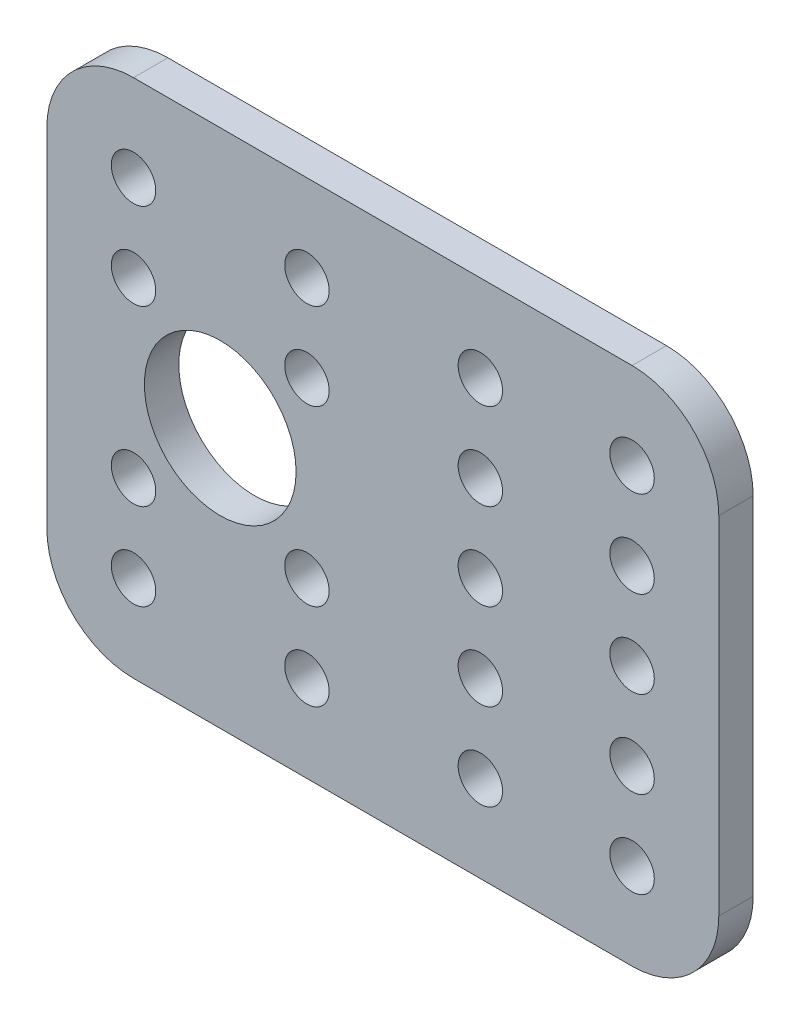
ISO-10303-21;
HEADER;
FILE_DESCRIPTION(('STEP AP214'),'2;1');
FILE_NAME('part.step','',(''),(''),'','','');
FILE_SCHEMA(('AUTOMOTIVE_DESIGN { 1 0 10303 214 1 1 1 1 }'));
ENDSEC;
DATA;
#1=APPLICATION_CONTEXT('core data for automotive mechanical design processes');
#2=APPLICATION_PROTOCOL_DEFINITION('international standard','automotive_design',2000,#1);
#3=PRODUCT_CONTEXT('',#1,'mechanical');
#4=PRODUCT('Part','Part','',(#3));
#5=PRODUCT_RELATED_PRODUCT_CATEGORY('part','',(#4));
#6=PRODUCT_DEFINITION_FORMATION('','',#4);
#7=PRODUCT_DEFINITION_CONTEXT('part definition',#1,'design');
#8=PRODUCT_DEFINITION('design','',#6,#7);
#9=PRODUCT_DEFINITION_SHAPE('','',#8);
#10=(LENGTH_UNIT() NAMED_UNIT(*) SI_UNIT(.MILLI.,.METRE.));
#11=(NAMED_UNIT(*) PLANE_ANGLE_UNIT() SI_UNIT($,.RADIAN.));
#12=(NAMED_UNIT(*) SI_UNIT($,.STERADIAN.) SOLID_ANGLE_UNIT());
#13=UNCERTAINTY_MEASURE_WITH_UNIT(LENGTH_MEASURE(1.E-05),#10,'distance_accuracy_value','');
#14=(GEOMETRIC_REPRESENTATION_CONTEXT(3) GLOBAL_UNCERTAINTY_ASSIGNED_CONTEXT((#13)) GLOBAL_UNIT_ASSIGNED_CONTEXT((#10,
#11,#12)) REPRESENTATION_CONTEXT('',''));
#15=CARTESIAN_POINT('',(0.,0.,0.));
#16=DIRECTION('',(0.,0.,1.));
#17=DIRECTION('',(1.,0.,0.));
#18=AXIS2_PLACEMENT_3D('',#15,#16,#17);
#19=CARTESIAN_POINT('',(0.,0.,-3.175));
#20=DIRECTION('',(0.,0.,-1.));
#21=DIRECTION('',(1.,0.,0.));
#22=AXIS2_PLACEMENT_3D('',#19,#20,#21);
#23=PLANE('',#22);
#24=CARTESIAN_POINT('',(23.0000000000002,-8.00000000000001,-3.175));
#25=DIRECTION('',(0.,0.,1.));
#26=DIRECTION('',(1.,0.,0.));
#27=AXIS2_PLACEMENT_3D('',#24,#25,#26);
#28=CIRCLE('',#27,2.05);
#29=CARTESIAN_POINT('',(25.0500000000002,-8.00000000000001,-3.175));
#30=VERTEX_POINT('',#29);
#31=EDGE_CURVE('E273',#30,#30,#28,.T.);
#32=ORIENTED_EDGE('',*,*,#31,.T.);
#33=EDGE_LOOP('',(#32));
#34=FACE_BOUND('',#33,.T.);
#35=CARTESIAN_POINT('',(23.0000000000001,7.99999999999999,-3.175));
#36=DIRECTION('',(0.,0.,1.));
#37=DIRECTION('',(1.,0.,0.));
#38=AXIS2_PLACEMENT_3D('',#35,#36,#37);
#39=CIRCLE('',#38,2.05);
#40=CARTESIAN_POINT('',(25.0500000000001,7.99999999999999,-3.175));
#41=VERTEX_POINT('',#40);
#42=EDGE_CURVE('E261',#41,#41,#39,.T.);
#43=ORIENTED_EDGE('',*,*,#42,.T.);
#44=EDGE_LOOP('',(#43));
#45=FACE_BOUND('',#44,.T.);
#46=CARTESIAN_POINT('',(-22.9999999999997,-8.00000000000001,-3.175));
#47=DIRECTION('',(0.,0.,1.));
#48=DIRECTION('',(1.,0.,0.));
#49=AXIS2_PLACEMENT_3D('',#46,#47,#48);
#50=CIRCLE('',#49,2.05);
#51=CARTESIAN_POINT('',(-20.9499999999997,-8.00000000000001,-3.175));
#52=VERTEX_POINT('',#51);
#53=EDGE_CURVE('E249',#52,#52,#50,.T.);
#54=ORIENTED_EDGE('',*,*,#53,.T.);
#55=EDGE_LOOP('',(#54));
#56=FACE_BOUND('',#55,.T.);
#57=CARTESIAN_POINT('',(9.00000000000034,-16.,-3.175));
#58=DIRECTION('',(0.,0.,1.));
#59=DIRECTION('',(1.,0.,0.));
#60=AXIS2_PLACEMENT_3D('',#57,#58,#59);
#61=CIRCLE('',#60,2.04999999999999);
#62=CARTESIAN_POINT('',(11.0500000000003,-16.,-3.175));
#63=VERTEX_POINT('',#62);
#64=EDGE_CURVE('E237',#63,#63,#61,.T.);
#65=ORIENTED_EDGE('',*,*,#64,.T.);
#66=EDGE_LOOP('',(#65));
#67=FACE_BOUND('',#66,.T.);
#68=CARTESIAN_POINT('',(9.00000000000026,-8.00000000000001,-3.175));
#69=DIRECTION('',(0.,0.,1.));
#70=DIRECTION('',(1.,0.,0.));
#71=AXIS2_PLACEMENT_3D('',#68,#69,#70);
#72=CIRCLE('',#71,2.04999999999999);
#73=CARTESIAN_POINT('',(11.0500000000003,-8.00000000000001,-3.175));
#74=VERTEX_POINT('',#73);
#75=EDGE_CURVE('E225',#74,#74,#72,.T.);
#76=ORIENTED_EDGE('',*,*,#75,.T.);
#77=EDGE_LOOP('',(#76));
#78=FACE_BOUND('',#77,.T.);
#79=CARTESIAN_POINT('',(9.00000000000017,0.,-3.175));
#80=DIRECTION('',(0.,0.,1.));
#81=DIRECTION('',(1.,0.,0.));
#82=AXIS2_PLACEMENT_3D('',#79,#80,#81);
#83=CIRCLE('',#82,2.04999999999999);
#84=CARTESIAN_POINT('',(11.0500000000002,0.,-3.175));
#85=VERTEX_POINT('',#84);
#86=EDGE_CURVE('E213',#85,#85,#83,.T.);
#87=ORIENTED_EDGE('',*,*,#86,.T.);
#88=EDGE_LOOP('',(#87));
#89=FACE_BOUND('',#88,.T.);
#90=CARTESIAN_POINT('',(-6.99999999999991,7.99999999999999,-3.175));
#91=DIRECTION('',(0.,0.,1.));
#92=DIRECTION('',(1.,0.,0.));
#93=AXIS2_PLACEMENT_3D('',#90,#91,#92);
#94=CIRCLE('',#93,2.05);
#95=CARTESIAN_POINT('',(-4.94999999999991,7.99999999999999,-3.175));
#96=VERTEX_POINT('',#95);
#97=EDGE_CURVE('E201',#96,#96,#94,.T.);
#98=ORIENTED_EDGE('',*,*,#97,.T.);
#99=EDGE_LOOP('',(#98));
#100=FACE_BOUND('',#99,.T.);
#101=CARTESIAN_POINT('',(-6.99999999999999,16.,-3.175));
#102=DIRECTION('',(0.,0.,1.));
#103=DIRECTION('',(1.,0.,0.));
#104=AXIS2_PLACEMENT_3D('',#101,#102,#103);
#105=CIRCLE('',#104,2.05);
#106=CARTESIAN_POINT('',(-4.94999999999999,16.,-3.175));
#107=VERTEX_POINT('',#106);
#108=EDGE_CURVE('E189',#107,#107,#105,.T.);
#109=ORIENTED_EDGE('',*,*,#108,.T.);
#110=EDGE_LOOP('',(#109));
#111=FACE_BOUND('',#110,.T.);
#112=CARTESIAN_POINT('',(-23.,16.,-3.175));
#113=DIRECTION('',(0.,0.,1.));
#114=DIRECTION('',(1.,0.,0.));
#115=AXIS2_PLACEMENT_3D('',#112,#113,#114);
#116=CIRCLE('',#115,2.05);
#117=CARTESIAN_POINT('',(-20.95,16.,-3.175));
#118=VERTEX_POINT('',#117);
#119=EDGE_CURVE('E178',#118,#118,#116,.T.);
#120=ORIENTED_EDGE('',*,*,#119,.T.);
#121=EDGE_LOOP('',(#120));
#122=FACE_BOUND('',#121,.T.);
#123=DIRECTION('',(0.,1.,0.));
#124=VECTOR('',#123,1.);
#125=CARTESIAN_POINT('',(31.,-24.,-3.175));
#126=LINE('',#125,#124);
#127=CARTESIAN_POINT('',(31.,-16.,-3.175));
#128=VERTEX_POINT('',#127);
#129=CARTESIAN_POINT('',(31.,16.,-3.175));
#130=VERTEX_POINT('',#129);
#131=EDGE_CURVE('E173',#128,#130,#126,.T.);
#132=ORIENTED_EDGE('',*,*,#131,.F.);
#133=CARTESIAN_POINT('',(23.,-16.,-3.175));
#134=DIRECTION('',(0.,0.,1.));
#135=DIRECTION('',(1.,0.,0.));
#136=AXIS2_PLACEMENT_3D('',#133,#134,#135);
#137=CIRCLE('',#136,8.);
#138=CARTESIAN_POINT('',(23.,-24.,-3.175));
#139=VERTEX_POINT('',#138);
#140=EDGE_CURVE('E152',#139,#128,#137,.T.);
#141=ORIENTED_EDGE('',*,*,#140,.F.);
#142=DIRECTION('',(1.,0.,0.));
#143=VECTOR('',#142,1.);
#144=CARTESIAN_POINT('',(31.,-24.,-3.175));
#145=LINE('',#144,#143);
#146=CARTESIAN_POINT('',(-23.,-24.,-3.175));
#147=VERTEX_POINT('',#146);
#148=EDGE_CURVE('E131',#147,#139,#145,.T.);
#149=ORIENTED_EDGE('',*,*,#148,.F.);
#150=CARTESIAN_POINT('',(-23.,-16.,-3.175));
#151=DIRECTION('',(0.,0.,1.));
#152=DIRECTION('',(1.,0.,0.));
#153=AXIS2_PLACEMENT_3D('',#150,#151,#152);
#154=CIRCLE('',#153,8.);
#155=CARTESIAN_POINT('',(-31.,-16.,-3.175));
#156=VERTEX_POINT('',#155);
#157=EDGE_CURVE('E150',#156,#147,#154,.T.);
#158=ORIENTED_EDGE('',*,*,#157,.F.);
#159=DIRECTION('',(0.,-1.,0.));
#160=VECTOR('',#159,1.);
#161=CARTESIAN_POINT('',(-31.,-24.,-3.175));
#162=LINE('',#161,#160);
#163=CARTESIAN_POINT('',(-31.,16.,-3.175));
#164=VERTEX_POINT('',#163);
#165=EDGE_CURVE('E128',#164,#156,#162,.T.);
#166=ORIENTED_EDGE('',*,*,#165,.F.);
#167=CARTESIAN_POINT('',(-23.,16.,-3.175));
#168=DIRECTION('',(0.,0.,1.));
#169=DIRECTION('',(1.,0.,0.));
#170=AXIS2_PLACEMENT_3D('',#167,#168,#169);
#171=CIRCLE('',#170,8.);
#172=CARTESIAN_POINT('',(-23.,24.,-3.175));
#173=VERTEX_POINT('',#172);
#174=EDGE_CURVE('E147',#173,#164,#171,.T.);
#175=ORIENTED_EDGE('',*,*,#174,.F.);
#176=DIRECTION('',(-1.,0.,0.));
#177=VECTOR('',#176,1.);
#178=CARTESIAN_POINT('',(31.,24.,-3.175));
#179=LINE('',#178,#177);
#180=CARTESIAN_POINT('',(23.,24.,-3.175));
#181=VERTEX_POINT('',#180);
#182=EDGE_CURVE('E137',#181,#173,#179,.T.);
#183=ORIENTED_EDGE('',*,*,#182,.F.);
#184=CARTESIAN_POINT('',(23.,16.,-3.175));
#185=DIRECTION('',(0.,0.,1.));
#186=DIRECTION('',(1.,0.,0.));
#187=AXIS2_PLACEMENT_3D('',#184,#185,#186);
#188=CIRCLE('',#187,8.);
#189=EDGE_CURVE('E106',#130,#181,#188,.T.);
#190=ORIENTED_EDGE('',*,*,#189,.F.);
#191=EDGE_LOOP('',(#132,#141,#149,#158,#166,#175,#183,#190));
#192=FACE_BOUND('',#191,.T.);
#193=CARTESIAN_POINT('',(-15.,0.,-3.175));
#194=DIRECTION('',(0.,0.,1.));
#195=DIRECTION('',(1.,0.,0.));
#196=AXIS2_PLACEMENT_3D('',#193,#194,#195);
#197=CIRCLE('',#196,7.);
#198=CARTESIAN_POINT('',(-7.99999999999999,0.,-3.175));
#199=VERTEX_POINT('',#198);
#200=EDGE_CURVE('E165',#199,#199,#197,.T.);
#201=ORIENTED_EDGE('',*,*,#200,.T.);
#202=EDGE_LOOP('',(#201));
#203=FACE_BOUND('',#202,.T.);
#204=CARTESIAN_POINT('',(23.,16.,-3.175));
#205=DIRECTION('',(0.,0.,1.));
#206=DIRECTION('',(1.,0.,0.));
#207=AXIS2_PLACEMENT_3D('',#204,#205,#206);
#208=CIRCLE('',#207,2.05);
#209=CARTESIAN_POINT('',(25.05,16.,-3.175));
#210=VERTEX_POINT('',#209);
#211=EDGE_CURVE('E183',#210,#210,#208,.T.);
#212=ORIENTED_EDGE('',*,*,#211,.T.);
#213=EDGE_LOOP('',(#212));
#214=FACE_BOUND('',#213,.T.);
#215=CARTESIAN_POINT('',(9.00000000000001,16.,-3.175));
#216=DIRECTION('',(0.,0.,1.));
#217=DIRECTION('',(1.,0.,0.));
#218=AXIS2_PLACEMENT_3D('',#215,#216,#217);
#219=CIRCLE('',#218,2.04999999999999);
#220=CARTESIAN_POINT('',(11.05,16.,-3.175));
#221=VERTEX_POINT('',#220);
#222=EDGE_CURVE('E195',#221,#221,#219,.T.);
#223=ORIENTED_EDGE('',*,*,#222,.T.);
#224=EDGE_LOOP('',(#223));
#225=FACE_BOUND('',#224,.T.);
#226=CARTESIAN_POINT('',(9.00000000000009,7.99999999999999,-3.175));
#227=DIRECTION('',(0.,0.,1.));
#228=DIRECTION('',(1.,0.,0.));
#229=AXIS2_PLACEMENT_3D('',#226,#227,#228);
#230=CIRCLE('',#229,2.04999999999999);
#231=CARTESIAN_POINT('',(11.0500000000001,7.99999999999999,-3.175));
#232=VERTEX_POINT('',#231);
#233=EDGE_CURVE('E207',#232,#232,#230,.T.);
#234=ORIENTED_EDGE('',*,*,#233,.T.);
#235=EDGE_LOOP('',(#234));
#236=FACE_BOUND('',#235,.T.);
#237=CARTESIAN_POINT('',(-6.99999999999974,-8.00000000000001,-3.175));
#238=DIRECTION('',(0.,0.,1.));
#239=DIRECTION('',(1.,0.,0.));
#240=AXIS2_PLACEMENT_3D('',#237,#238,#239);
#241=CIRCLE('',#240,2.04999999999999);
#242=CARTESIAN_POINT('',(-4.94999999999975,-8.00000000000001,-3.175));
#243=VERTEX_POINT('',#242);
#244=EDGE_CURVE('E219',#243,#243,#241,.T.);
#245=ORIENTED_EDGE('',*,*,#244,.T.);
#246=EDGE_LOOP('',(#245));
#247=FACE_BOUND('',#246,.T.);
#248=CARTESIAN_POINT('',(-6.99999999999966,-16.,-3.175));
#249=DIRECTION('',(0.,0.,1.));
#250=DIRECTION('',(1.,0.,0.));
#251=AXIS2_PLACEMENT_3D('',#248,#249,#250);
#252=CIRCLE('',#251,2.05);
#253=CARTESIAN_POINT('',(-4.94999999999966,-16.,-3.175));
#254=VERTEX_POINT('',#253);
#255=EDGE_CURVE('E231',#254,#254,#252,.T.);
#256=ORIENTED_EDGE('',*,*,#255,.T.);
#257=EDGE_LOOP('',(#256));
#258=FACE_BOUND('',#257,.T.);
#259=CARTESIAN_POINT('',(-22.9999999999999,7.99999999999999,-3.175));
#260=DIRECTION('',(0.,0.,1.));
#261=DIRECTION('',(1.,0.,0.));
#262=AXIS2_PLACEMENT_3D('',#259,#260,#261);
#263=CIRCLE('',#262,2.05);
#264=CARTESIAN_POINT('',(-20.9499999999999,7.99999999999999,-3.175));
#265=VERTEX_POINT('',#264);
#266=EDGE_CURVE('E243',#265,#265,#263,.T.);
#267=ORIENTED_EDGE('',*,*,#266,.T.);
#268=EDGE_LOOP('',(#267));
#269=FACE_BOUND('',#268,.T.);
#270=CARTESIAN_POINT('',(-22.9999999999997,-16.,-3.175));
#271=DIRECTION('',(0.,0.,1.));
#272=DIRECTION('',(1.,0.,0.));
#273=AXIS2_PLACEMENT_3D('',#270,#271,#272);
#274=CIRCLE('',#273,2.05);
#275=CARTESIAN_POINT('',(-20.9499999999997,-16.,-3.175));
#276=VERTEX_POINT('',#275);
#277=EDGE_CURVE('E255',#276,#276,#274,.T.);
#278=ORIENTED_EDGE('',*,*,#277,.T.);
#279=EDGE_LOOP('',(#278));
#280=FACE_BOUND('',#279,.T.);
#281=CARTESIAN_POINT('',(23.0000000000002,0.,-3.175));
#282=DIRECTION('',(0.,0.,1.));
#283=DIRECTION('',(1.,0.,0.));
#284=AXIS2_PLACEMENT_3D('',#281,#282,#283);
#285=CIRCLE('',#284,2.05);
#286=CARTESIAN_POINT('',(25.0500000000002,0.,-3.175));
#287=VERTEX_POINT('',#286);
#288=EDGE_CURVE('E267',#287,#287,#285,.T.);
#289=ORIENTED_EDGE('',*,*,#288,.T.);
#290=EDGE_LOOP('',(#289));
#291=FACE_BOUND('',#290,.T.);
#292=CARTESIAN_POINT('',(23.0000000000003,-16.,-3.175));
#293=DIRECTION('',(0.,0.,1.));
#294=DIRECTION('',(1.,0.,0.));
#295=AXIS2_PLACEMENT_3D('',#292,#293,#294);
#296=CIRCLE('',#295,2.05);
#297=CARTESIAN_POINT('',(25.0500000000003,-16.,-3.175));
#298=VERTEX_POINT('',#297);
#299=EDGE_CURVE('E279',#298,#298,#296,.T.);
#300=ORIENTED_EDGE('',*,*,#299,.T.);
#301=EDGE_LOOP('',(#300));
#302=FACE_BOUND('',#301,.T.);
#303=ADVANCED_FACE('F35',(#34,#45,#56,#67,#78,#89,#100,#111,#122,#192,#203,#214,#225,#236,#247,
#258,#269,#280,#291,#302),#23,.T.);
#304=CARTESIAN_POINT('',(0.,0.,0.));
#305=DIRECTION('',(0.,0.,-1.));
#306=DIRECTION('',(1.,0.,0.));
#307=AXIS2_PLACEMENT_3D('',#304,#305,#306);
#308=PLANE('',#307);
#309=DIRECTION('',(-1.,0.,0.));
#310=VECTOR('',#309,1.);
#311=CARTESIAN_POINT('',(31.,24.,0.));
#312=LINE('',#311,#310);
#313=CARTESIAN_POINT('',(23.,24.,0.));
#314=VERTEX_POINT('',#313);
#315=CARTESIAN_POINT('',(-23.,24.,0.));
#316=VERTEX_POINT('',#315);
#317=EDGE_CURVE('E119',#314,#316,#312,.T.);
#318=ORIENTED_EDGE('',*,*,#317,.T.);
#319=CARTESIAN_POINT('',(-23.,16.,0.));
#320=DIRECTION('',(0.,0.,1.));
#321=DIRECTION('',(1.,0.,0.));
#322=AXIS2_PLACEMENT_3D('',#319,#320,#321);
#323=CIRCLE('',#322,8.);
#324=CARTESIAN_POINT('',(-31.,16.,0.));
#325=VERTEX_POINT('',#324);
#326=EDGE_CURVE('E111',#325,#316,#323,.F.);
#327=ORIENTED_EDGE('',*,*,#326,.F.);
#328=DIRECTION('',(0.,-1.,0.));
#329=VECTOR('',#328,1.);
#330=CARTESIAN_POINT('',(-31.,-24.,0.));
#331=LINE('',#330,#329);
#332=CARTESIAN_POINT('',(-31.,-16.,0.));
#333=VERTEX_POINT('',#332);
#334=EDGE_CURVE('E162',#325,#333,#331,.T.);
#335=ORIENTED_EDGE('',*,*,#334,.T.);
#336=CARTESIAN_POINT('',(-23.,-16.,0.));
#337=DIRECTION('',(0.,0.,1.));
#338=DIRECTION('',(1.,0.,0.));
#339=AXIS2_PLACEMENT_3D('',#336,#337,#338);
#340=CIRCLE('',#339,8.);
#341=CARTESIAN_POINT('',(-23.,-24.,0.));
#342=VERTEX_POINT('',#341);
#343=EDGE_CURVE('E140',#342,#333,#340,.F.);
#344=ORIENTED_EDGE('',*,*,#343,.F.);
#345=DIRECTION('',(1.,0.,0.));
#346=VECTOR('',#345,1.);
#347=CARTESIAN_POINT('',(31.,-24.,0.));
#348=LINE('',#347,#346);
#349=CARTESIAN_POINT('',(23.,-24.,0.));
#350=VERTEX_POINT('',#349);
#351=EDGE_CURVE('E133',#342,#350,#348,.T.);
#352=ORIENTED_EDGE('',*,*,#351,.T.);
#353=CARTESIAN_POINT('',(23.,-16.,0.));
#354=DIRECTION('',(0.,0.,1.));
#355=DIRECTION('',(1.,0.,0.));
#356=AXIS2_PLACEMENT_3D('',#353,#354,#355);
#357=CIRCLE('',#356,8.);
#358=CARTESIAN_POINT('',(31.,-16.,0.));
#359=VERTEX_POINT('',#358);
#360=EDGE_CURVE('E124',#359,#350,#357,.F.);
#361=ORIENTED_EDGE('',*,*,#360,.F.);
#362=DIRECTION('',(0.,1.,0.));
#363=VECTOR('',#362,1.);
#364=CARTESIAN_POINT('',(31.,-24.,0.));
#365=LINE('',#364,#363);
#366=CARTESIAN_POINT('',(31.,16.,0.));
#367=VERTEX_POINT('',#366);
#368=EDGE_CURVE('E122',#359,#367,#365,.T.);
#369=ORIENTED_EDGE('',*,*,#368,.T.);
#370=CARTESIAN_POINT('',(23.,16.,0.));
#371=DIRECTION('',(0.,0.,1.));
#372=DIRECTION('',(1.,0.,0.));
#373=AXIS2_PLACEMENT_3D('',#370,#371,#372);
#374=CIRCLE('',#373,8.);
#375=EDGE_CURVE('E103',#314,#367,#374,.F.);
#376=ORIENTED_EDGE('',*,*,#375,.F.);
#377=EDGE_LOOP('',(#318,#327,#335,#344,#352,#361,#369,#376));
#378=FACE_BOUND('',#377,.T.);
#379=CARTESIAN_POINT('',(-15.,0.,0.));
#380=DIRECTION('',(0.,0.,1.));
#381=DIRECTION('',(1.,0.,0.));
#382=AXIS2_PLACEMENT_3D('',#379,#380,#381);
#383=CIRCLE('',#382,7.);
#384=CARTESIAN_POINT('',(-7.99999999999999,0.,0.));
#385=VERTEX_POINT('',#384);
#386=EDGE_CURVE('E169',#385,#385,#383,.T.);
#387=ORIENTED_EDGE('',*,*,#386,.F.);
#388=EDGE_LOOP('',(#387));
#389=FACE_BOUND('',#388,.T.);
#390=CARTESIAN_POINT('',(-23.,16.,0.));
#391=DIRECTION('',(0.,0.,1.));
#392=DIRECTION('',(1.,0.,0.));
#393=AXIS2_PLACEMENT_3D('',#390,#391,#392);
#394=CIRCLE('',#393,2.05);
#395=CARTESIAN_POINT('',(-20.95,16.,0.));
#396=VERTEX_POINT('',#395);
#397=EDGE_CURVE('E180',#396,#396,#394,.T.);
#398=ORIENTED_EDGE('',*,*,#397,.F.);
#399=EDGE_LOOP('',(#398));
#400=FACE_BOUND('',#399,.T.);
#401=CARTESIAN_POINT('',(23.,16.,0.));
#402=DIRECTION('',(0.,0.,1.));
#403=DIRECTION('',(1.,0.,0.));
#404=AXIS2_PLACEMENT_3D('',#401,#402,#403);
#405=CIRCLE('',#404,2.05);
#406=CARTESIAN_POINT('',(25.05,16.,0.));
#407=VERTEX_POINT('',#406);
#408=EDGE_CURVE('E186',#407,#407,#405,.T.);
#409=ORIENTED_EDGE('',*,*,#408,.F.);
#410=EDGE_LOOP('',(#409));
#411=FACE_BOUND('',#410,.T.);
#412=CARTESIAN_POINT('',(-6.99999999999999,16.,0.));
#413=DIRECTION('',(0.,0.,1.));
#414=DIRECTION('',(1.,0.,0.));
#415=AXIS2_PLACEMENT_3D('',#412,#413,#414);
#416=CIRCLE('',#415,2.05);
#417=CARTESIAN_POINT('',(-4.94999999999999,16.,0.));
#418=VERTEX_POINT('',#417);
#419=EDGE_CURVE('E192',#418,#418,#416,.T.);
#420=ORIENTED_EDGE('',*,*,#419,.F.);
#421=EDGE_LOOP('',(#420));
#422=FACE_BOUND('',#421,.T.);
#423=CARTESIAN_POINT('',(9.00000000000001,16.,0.));
#424=DIRECTION('',(0.,0.,1.));
#425=DIRECTION('',(1.,0.,0.));
#426=AXIS2_PLACEMENT_3D('',#423,#424,#425);
#427=CIRCLE('',#426,2.04999999999999);
#428=CARTESIAN_POINT('',(11.05,16.,0.));
#429=VERTEX_POINT('',#428);
#430=EDGE_CURVE('E198',#429,#429,#427,.T.);
#431=ORIENTED_EDGE('',*,*,#430,.F.);
#432=EDGE_LOOP('',(#431));
#433=FACE_BOUND('',#432,.T.);
#434=CARTESIAN_POINT('',(-6.99999999999991,7.99999999999999,0.));
#435=DIRECTION('',(0.,0.,1.));
#436=DIRECTION('',(1.,0.,0.));
#437=AXIS2_PLACEMENT_3D('',#434,#435,#436);
#438=CIRCLE('',#437,2.05);
#439=CARTESIAN_POINT('',(-4.94999999999991,7.99999999999999,0.));
#440=VERTEX_POINT('',#439);
#441=EDGE_CURVE('E204',#440,#440,#438,.T.);
#442=ORIENTED_EDGE('',*,*,#441,.F.);
#443=EDGE_LOOP('',(#442));
#444=FACE_BOUND('',#443,.T.);
#445=CARTESIAN_POINT('',(9.00000000000009,7.99999999999999,0.));
#446=DIRECTION('',(0.,0.,1.));
#447=DIRECTION('',(1.,0.,0.));
#448=AXIS2_PLACEMENT_3D('',#445,#446,#447);
#449=CIRCLE('',#448,2.04999999999999);
#450=CARTESIAN_POINT('',(11.0500000000001,7.99999999999999,0.));
#451=VERTEX_POINT('',#450);
#452=EDGE_CURVE('E210',#451,#451,#449,.T.);
#453=ORIENTED_EDGE('',*,*,#452,.F.);
#454=EDGE_LOOP('',(#453));
#455=FACE_BOUND('',#454,.T.);
#456=CARTESIAN_POINT('',(9.00000000000017,0.,0.));
#457=DIRECTION('',(0.,0.,1.));
#458=DIRECTION('',(1.,0.,0.));
#459=AXIS2_PLACEMENT_3D('',#456,#457,#458);
#460=CIRCLE('',#459,2.04999999999999);
#461=CARTESIAN_POINT('',(11.0500000000002,0.,0.));
#462=VERTEX_POINT('',#461);
#463=EDGE_CURVE('E216',#462,#462,#460,.T.);
#464=ORIENTED_EDGE('',*,*,#463,.F.);
#465=EDGE_LOOP('',(#464));
#466=FACE_BOUND('',#465,.T.);
#467=CARTESIAN_POINT('',(-6.99999999999974,-8.00000000000001,0.));
#468=DIRECTION('',(0.,0.,1.));
#469=DIRECTION('',(1.,0.,0.));
#470=AXIS2_PLACEMENT_3D('',#467,#468,#469);
#471=CIRCLE('',#470,2.04999999999999);
#472=CARTESIAN_POINT('',(-4.94999999999975,-8.00000000000001,0.));
#473=VERTEX_POINT('',#472);
#474=EDGE_CURVE('E222',#473,#473,#471,.T.);
#475=ORIENTED_EDGE('',*,*,#474,.F.);
#476=EDGE_LOOP('',(#475));
#477=FACE_BOUND('',#476,.T.);
#478=CARTESIAN_POINT('',(9.00000000000026,-8.00000000000001,0.));
#479=DIRECTION('',(0.,0.,1.));
#480=DIRECTION('',(1.,0.,0.));
#481=AXIS2_PLACEMENT_3D('',#478,#479,#480);
#482=CIRCLE('',#481,2.04999999999999);
#483=CARTESIAN_POINT('',(11.0500000000003,-8.00000000000001,0.));
#484=VERTEX_POINT('',#483);
#485=EDGE_CURVE('E228',#484,#484,#482,.T.);
#486=ORIENTED_EDGE('',*,*,#485,.F.);
#487=EDGE_LOOP('',(#486));
#488=FACE_BOUND('',#487,.T.);
#489=CARTESIAN_POINT('',(-6.99999999999966,-16.,0.));
#490=DIRECTION('',(0.,0.,1.));
#491=DIRECTION('',(1.,0.,0.));
#492=AXIS2_PLACEMENT_3D('',#489,#490,#491);
#493=CIRCLE('',#492,2.05);
#494=CARTESIAN_POINT('',(-4.94999999999966,-16.,0.));
#495=VERTEX_POINT('',#494);
#496=EDGE_CURVE('E234',#495,#495,#493,.T.);
#497=ORIENTED_EDGE('',*,*,#496,.F.);
#498=EDGE_LOOP('',(#497));
#499=FACE_BOUND('',#498,.T.);
#500=CARTESIAN_POINT('',(9.00000000000034,-16.,0.));
#501=DIRECTION('',(0.,0.,1.));
#502=DIRECTION('',(1.,0.,0.));
#503=AXIS2_PLACEMENT_3D('',#500,#501,#502);
#504=CIRCLE('',#503,2.04999999999999);
#505=CARTESIAN_POINT('',(11.0500000000003,-16.,0.));
#506=VERTEX_POINT('',#505);
#507=EDGE_CURVE('E240',#506,#506,#504,.T.);
#508=ORIENTED_EDGE('',*,*,#507,.F.);
#509=EDGE_LOOP('',(#508));
#510=FACE_BOUND('',#509,.T.);
#511=CARTESIAN_POINT('',(-22.9999999999999,7.99999999999999,0.));
#512=DIRECTION('',(0.,0.,1.));
#513=DIRECTION('',(1.,0.,0.));
#514=AXIS2_PLACEMENT_3D('',#511,#512,#513);
#515=CIRCLE('',#514,2.05);
#516=CARTESIAN_POINT('',(-20.9499999999999,7.99999999999999,0.));
#517=VERTEX_POINT('',#516);
#518=EDGE_CURVE('E246',#517,#517,#515,.T.);
#519=ORIENTED_EDGE('',*,*,#518,.F.);
#520=EDGE_LOOP('',(#519));
#521=FACE_BOUND('',#520,.T.);
#522=CARTESIAN_POINT('',(-22.9999999999997,-8.00000000000001,0.));
#523=DIRECTION('',(0.,0.,1.));
#524=DIRECTION('',(1.,0.,0.));
#525=AXIS2_PLACEMENT_3D('',#522,#523,#524);
#526=CIRCLE('',#525,2.05);
#527=CARTESIAN_POINT('',(-20.9499999999997,-8.00000000000001,0.));
#528=VERTEX_POINT('',#527);
#529=EDGE_CURVE('E252',#528,#528,#526,.T.);
#530=ORIENTED_EDGE('',*,*,#529,.F.);
#531=EDGE_LOOP('',(#530));
#532=FACE_BOUND('',#531,.T.);
#533=CARTESIAN_POINT('',(-22.9999999999997,-16.,0.));
#534=DIRECTION('',(0.,0.,1.));
#535=DIRECTION('',(1.,0.,0.));
#536=AXIS2_PLACEMENT_3D('',#533,#534,#535);
#537=CIRCLE('',#536,2.05);
#538=CARTESIAN_POINT('',(-20.9499999999997,-16.,0.));
#539=VERTEX_POINT('',#538);
#540=EDGE_CURVE('E258',#539,#539,#537,.T.);
#541=ORIENTED_EDGE('',*,*,#540,.F.);
#542=EDGE_LOOP('',(#541));
#543=FACE_BOUND('',#542,.T.);
#544=CARTESIAN_POINT('',(23.0000000000001,7.99999999999999,0.));
#545=DIRECTION('',(0.,0.,1.));
#546=DIRECTION('',(1.,0.,0.));
#547=AXIS2_PLACEMENT_3D('',#544,#545,#546);
#548=CIRCLE('',#547,2.05);
#549=CARTESIAN_POINT('',(25.0500000000001,7.99999999999999,0.));
#550=VERTEX_POINT('',#549);
#551=EDGE_CURVE('E264',#550,#550,#548,.T.);
#552=ORIENTED_EDGE('',*,*,#551,.F.);
#553=EDGE_LOOP('',(#552));
#554=FACE_BOUND('',#553,.T.);
#555=CARTESIAN_POINT('',(23.0000000000002,0.,0.));
#556=DIRECTION('',(0.,0.,1.));
#557=DIRECTION('',(1.,0.,0.));
#558=AXIS2_PLACEMENT_3D('',#555,#556,#557);
#559=CIRCLE('',#558,2.05);
#560=CARTESIAN_POINT('',(25.0500000000002,0.,0.));
#561=VERTEX_POINT('',#560);
#562=EDGE_CURVE('E270',#561,#561,#559,.T.);
#563=ORIENTED_EDGE('',*,*,#562,.F.);
#564=EDGE_LOOP('',(#563));
#565=FACE_BOUND('',#564,.T.);
#566=CARTESIAN_POINT('',(23.0000000000002,-8.00000000000001,0.));
#567=DIRECTION('',(0.,0.,1.));
#568=DIRECTION('',(1.,0.,0.));
#569=AXIS2_PLACEMENT_3D('',#566,#567,#568);
#570=CIRCLE('',#569,2.05);
#571=CARTESIAN_POINT('',(25.0500000000002,-8.00000000000001,0.));
#572=VERTEX_POINT('',#571);
#573=EDGE_CURVE('E276',#572,#572,#570,.T.);
#574=ORIENTED_EDGE('',*,*,#573,.F.);
#575=EDGE_LOOP('',(#574));
#576=FACE_BOUND('',#575,.T.);
#577=CARTESIAN_POINT('',(23.0000000000003,-16.,0.));
#578=DIRECTION('',(0.,0.,1.));
#579=DIRECTION('',(1.,0.,0.));
#580=AXIS2_PLACEMENT_3D('',#577,#578,#579);
#581=CIRCLE('',#580,2.05);
#582=CARTESIAN_POINT('',(25.0500000000003,-16.,0.));
#583=VERTEX_POINT('',#582);
#584=EDGE_CURVE('E282',#583,#583,#581,.T.);
#585=ORIENTED_EDGE('',*,*,#584,.F.);
#586=EDGE_LOOP('',(#585));
#587=FACE_BOUND('',#586,.T.);
#588=ADVANCED_FACE('F116',(#378,#389,#400,#411,#422,#433,#444,#455,#466,#477,#488,#499,#510,
#521,#532,#543,#554,#565,#576,#587),#308,.F.);
#589=CARTESIAN_POINT('',(-31.,-24.,-3.175));
#590=DIRECTION('',(1.,0.,0.));
#591=DIRECTION('',(0.,1.,0.));
#592=AXIS2_PLACEMENT_3D('',#589,#590,#591);
#593=PLANE('',#592);
#594=ORIENTED_EDGE('',*,*,#334,.F.);
#595=DIRECTION('',(0.,0.,1.));
#596=VECTOR('',#595,1.);
#597=CARTESIAN_POINT('',(-31.,16.,-3.175));
#598=LINE('',#597,#596);
#599=EDGE_CURVE('E43',#164,#325,#598,.T.);
#600=ORIENTED_EDGE('',*,*,#599,.F.);
#601=ORIENTED_EDGE('',*,*,#165,.T.);
#602=DIRECTION('',(0.,0.,1.));
#603=VECTOR('',#602,1.);
#604=CARTESIAN_POINT('',(-31.,-16.,-3.175));
#605=LINE('',#604,#603);
#606=EDGE_CURVE('E11',#333,#156,#605,.F.);
#607=ORIENTED_EDGE('',*,*,#606,.F.);
#608=EDGE_LOOP('',(#594,#600,#601,#607));
#609=FACE_BOUND('',#608,.T.);
#610=ADVANCED_FACE('F163',(#609),#593,.F.);
#611=CARTESIAN_POINT('',(31.,-24.,-3.175));
#612=DIRECTION('',(0.,1.,0.));
#613=DIRECTION('',(-1.,0.,0.));
#614=AXIS2_PLACEMENT_3D('',#611,#612,#613);
#615=PLANE('',#614);
#616=ORIENTED_EDGE('',*,*,#351,.F.);
#617=DIRECTION('',(0.,0.,1.));
#618=VECTOR('',#617,1.);
#619=CARTESIAN_POINT('',(-23.,-24.,-3.175));
#620=LINE('',#619,#618);
#621=EDGE_CURVE('E57',#147,#342,#620,.T.);
#622=ORIENTED_EDGE('',*,*,#621,.F.);
#623=ORIENTED_EDGE('',*,*,#148,.T.);
#624=DIRECTION('',(0.,0.,1.));
#625=VECTOR('',#624,1.);
#626=CARTESIAN_POINT('',(23.,-24.,-3.175));
#627=LINE('',#626,#625);
#628=EDGE_CURVE('E50',#350,#139,#627,.F.);
#629=ORIENTED_EDGE('',*,*,#628,.F.);
#630=EDGE_LOOP('',(#616,#622,#623,#629));
#631=FACE_BOUND('',#630,.T.);
#632=ADVANCED_FACE('F302',(#631),#615,.F.);
#633=CARTESIAN_POINT('',(31.,-24.,-3.175));
#634=DIRECTION('',(-1.,0.,0.));
#635=DIRECTION('',(0.,-1.,0.));
#636=AXIS2_PLACEMENT_3D('',#633,#634,#635);
#637=PLANE('',#636);
#638=ORIENTED_EDGE('',*,*,#368,.F.);
#639=DIRECTION('',(0.,0.,1.));
#640=VECTOR('',#639,1.);
#641=CARTESIAN_POINT('',(31.,-16.,-3.175));
#642=LINE('',#641,#640);
#643=EDGE_CURVE('E123',#128,#359,#642,.T.);
#644=ORIENTED_EDGE('',*,*,#643,.F.);
#645=ORIENTED_EDGE('',*,*,#131,.T.);
#646=DIRECTION('',(0.,0.,1.));
#647=VECTOR('',#646,1.);
#648=CARTESIAN_POINT('',(31.,16.,-3.175));
#649=LINE('',#648,#647);
#650=EDGE_CURVE('E145',#367,#130,#649,.F.);
#651=ORIENTED_EDGE('',*,*,#650,.F.);
#652=EDGE_LOOP('',(#638,#644,#645,#651));
#653=FACE_BOUND('',#652,.T.);
#654=ADVANCED_FACE('F311',(#653),#637,.F.);
#655=CARTESIAN_POINT('',(31.,24.,-3.175));
#656=DIRECTION('',(0.,-1.,0.));
#657=DIRECTION('',(0.,0.,1.));
#658=AXIS2_PLACEMENT_3D('',#655,#656,#657);
#659=PLANE('',#658);
#660=ORIENTED_EDGE('',*,*,#182,.T.);
#661=DIRECTION('',(0.,0.,1.));
#662=VECTOR('',#661,1.);
#663=CARTESIAN_POINT('',(-23.,24.,-3.175));
#664=LINE('',#663,#662);
#665=EDGE_CURVE('E112',#316,#173,#664,.F.);
#666=ORIENTED_EDGE('',*,*,#665,.F.);
#667=ORIENTED_EDGE('',*,*,#317,.F.);
#668=DIRECTION('',(0.,0.,1.));
#669=VECTOR('',#668,1.);
#670=CARTESIAN_POINT('',(23.,24.,-3.175));
#671=LINE('',#670,#669);
#672=EDGE_CURVE('E100',#181,#314,#671,.T.);
#673=ORIENTED_EDGE('',*,*,#672,.F.);
#674=EDGE_LOOP('',(#660,#666,#667,#673));
#675=FACE_BOUND('',#674,.T.);
#676=ADVANCED_FACE('F126',(#675),#659,.F.);
#677=CARTESIAN_POINT('',(-15.,0.,-3.175));
#678=DIRECTION('',(0.,0.,1.));
#679=DIRECTION('',(-1.,0.,0.));
#680=AXIS2_PLACEMENT_3D('',#677,#678,#679);
#681=CYLINDRICAL_SURFACE('',#680,7.);
#682=ORIENTED_EDGE('',*,*,#200,.F.);
#683=EDGE_LOOP('',(#682));
#684=FACE_BOUND('',#683,.T.);
#685=ORIENTED_EDGE('',*,*,#386,.T.);
#686=EDGE_LOOP('',(#685));
#687=FACE_BOUND('',#686,.T.);
#688=ADVANCED_FACE('F310',(#684,#687),#681,.F.);
#689=CARTESIAN_POINT('',(-23.,16.,-3.175));
#690=DIRECTION('',(0.,0.,1.));
#691=DIRECTION('',(-1.,0.,0.));
#692=AXIS2_PLACEMENT_3D('',#689,#690,#691);
#693=CYLINDRICAL_SURFACE('',#692,2.05);
#694=ORIENTED_EDGE('',*,*,#119,.F.);
#695=EDGE_LOOP('',(#694));
#696=FACE_BOUND('',#695,.T.);
#697=ORIENTED_EDGE('',*,*,#397,.T.);
#698=EDGE_LOOP('',(#697));
#699=FACE_BOUND('',#698,.T.);
#700=ADVANCED_FACE('F422',(#696,#699),#693,.F.);
#701=CARTESIAN_POINT('',(23.,16.,-3.175));
#702=DIRECTION('',(0.,0.,1.));
#703=DIRECTION('',(-1.,0.,0.));
#704=AXIS2_PLACEMENT_3D('',#701,#702,#703);
#705=CYLINDRICAL_SURFACE('',#704,2.05);
#706=ORIENTED_EDGE('',*,*,#211,.F.);
#707=EDGE_LOOP('',(#706));
#708=FACE_BOUND('',#707,.T.);
#709=ORIENTED_EDGE('',*,*,#408,.T.);
#710=EDGE_LOOP('',(#709));
#711=FACE_BOUND('',#710,.T.);
#712=ADVANCED_FACE('F418',(#708,#711),#705,.F.);
#713=CARTESIAN_POINT('',(-6.99999999999999,16.,-3.175));
#714=DIRECTION('',(0.,0.,1.));
#715=DIRECTION('',(-1.,0.,0.));
#716=AXIS2_PLACEMENT_3D('',#713,#714,#715);
#717=CYLINDRICAL_SURFACE('',#716,2.05);
#718=ORIENTED_EDGE('',*,*,#108,.F.);
#719=EDGE_LOOP('',(#718));
#720=FACE_BOUND('',#719,.T.);
#721=ORIENTED_EDGE('',*,*,#419,.T.);
#722=EDGE_LOOP('',(#721));
#723=FACE_BOUND('',#722,.T.);
#724=ADVANCED_FACE('F414',(#720,#723),#717,.F.);
#725=CARTESIAN_POINT('',(9.00000000000001,16.,-3.175));
#726=DIRECTION('',(0.,0.,1.));
#727=DIRECTION('',(-1.,0.,0.));
#728=AXIS2_PLACEMENT_3D('',#725,#726,#727);
#729=CYLINDRICAL_SURFACE('',#728,2.04999999999999);
#730=ORIENTED_EDGE('',*,*,#222,.F.);
#731=EDGE_LOOP('',(#730));
#732=FACE_BOUND('',#731,.T.);
#733=ORIENTED_EDGE('',*,*,#430,.T.);
#734=EDGE_LOOP('',(#733));
#735=FACE_BOUND('',#734,.T.);
#736=ADVANCED_FACE('F410',(#732,#735),#729,.F.);
#737=CARTESIAN_POINT('',(-6.99999999999991,7.99999999999999,-3.175));
#738=DIRECTION('',(0.,0.,1.));
#739=DIRECTION('',(-1.,0.,0.));
#740=AXIS2_PLACEMENT_3D('',#737,#738,#739);
#741=CYLINDRICAL_SURFACE('',#740,2.05);
#742=ORIENTED_EDGE('',*,*,#97,.F.);
#743=EDGE_LOOP('',(#742));
#744=FACE_BOUND('',#743,.T.);
#745=ORIENTED_EDGE('',*,*,#441,.T.);
#746=EDGE_LOOP('',(#745));
#747=FACE_BOUND('',#746,.T.);
#748=ADVANCED_FACE('F406',(#744,#747),#741,.F.);
#749=CARTESIAN_POINT('',(9.00000000000009,7.99999999999999,-3.175));
#750=DIRECTION('',(0.,0.,1.));
#751=DIRECTION('',(-1.,0.,0.));
#752=AXIS2_PLACEMENT_3D('',#749,#750,#751);
#753=CYLINDRICAL_SURFACE('',#752,2.04999999999999);
#754=ORIENTED_EDGE('',*,*,#233,.F.);
#755=EDGE_LOOP('',(#754));
#756=FACE_BOUND('',#755,.T.);
#757=ORIENTED_EDGE('',*,*,#452,.T.);
#758=EDGE_LOOP('',(#757));
#759=FACE_BOUND('',#758,.T.);
#760=ADVANCED_FACE('F402',(#756,#759),#753,.F.);
#761=CARTESIAN_POINT('',(9.00000000000017,0.,-3.175));
#762=DIRECTION('',(0.,0.,1.));
#763=DIRECTION('',(-1.,0.,0.));
#764=AXIS2_PLACEMENT_3D('',#761,#762,#763);
#765=CYLINDRICAL_SURFACE('',#764,2.04999999999999);
#766=ORIENTED_EDGE('',*,*,#86,.F.);
#767=EDGE_LOOP('',(#766));
#768=FACE_BOUND('',#767,.T.);
#769=ORIENTED_EDGE('',*,*,#463,.T.);
#770=EDGE_LOOP('',(#769));
#771=FACE_BOUND('',#770,.T.);
#772=ADVANCED_FACE('F398',(#768,#771),#765,.F.);
#773=CARTESIAN_POINT('',(-6.99999999999974,-8.00000000000001,-3.175));
#774=DIRECTION('',(0.,0.,1.));
#775=DIRECTION('',(-1.,0.,0.));
#776=AXIS2_PLACEMENT_3D('',#773,#774,#775);
#777=CYLINDRICAL_SURFACE('',#776,2.04999999999999);
#778=ORIENTED_EDGE('',*,*,#244,.F.);
#779=EDGE_LOOP('',(#778));
#780=FACE_BOUND('',#779,.T.);
#781=ORIENTED_EDGE('',*,*,#474,.T.);
#782=EDGE_LOOP('',(#781));
#783=FACE_BOUND('',#782,.T.);
#784=ADVANCED_FACE('F394',(#780,#783),#777,.F.);
#785=CARTESIAN_POINT('',(9.00000000000026,-8.00000000000001,-3.175));
#786=DIRECTION('',(0.,0.,1.));
#787=DIRECTION('',(-1.,0.,0.));
#788=AXIS2_PLACEMENT_3D('',#785,#786,#787);
#789=CYLINDRICAL_SURFACE('',#788,2.04999999999999);
#790=ORIENTED_EDGE('',*,*,#75,.F.);
#791=EDGE_LOOP('',(#790));
#792=FACE_BOUND('',#791,.T.);
#793=ORIENTED_EDGE('',*,*,#485,.T.);
#794=EDGE_LOOP('',(#793));
#795=FACE_BOUND('',#794,.T.);
#796=ADVANCED_FACE('F390',(#792,#795),#789,.F.);
#797=CARTESIAN_POINT('',(-6.99999999999966,-16.,-3.175));
#798=DIRECTION('',(0.,0.,1.));
#799=DIRECTION('',(-1.,0.,0.));
#800=AXIS2_PLACEMENT_3D('',#797,#798,#799);
#801=CYLINDRICAL_SURFACE('',#800,2.05);
#802=ORIENTED_EDGE('',*,*,#255,.F.);
#803=EDGE_LOOP('',(#802));
#804=FACE_BOUND('',#803,.T.);
#805=ORIENTED_EDGE('',*,*,#496,.T.);
#806=EDGE_LOOP('',(#805));
#807=FACE_BOUND('',#806,.T.);
#808=ADVANCED_FACE('F386',(#804,#807),#801,.F.);
#809=CARTESIAN_POINT('',(9.00000000000034,-16.,-3.175));
#810=DIRECTION('',(0.,0.,1.));
#811=DIRECTION('',(-1.,0.,0.));
#812=AXIS2_PLACEMENT_3D('',#809,#810,#811);
#813=CYLINDRICAL_SURFACE('',#812,2.04999999999999);
#814=ORIENTED_EDGE('',*,*,#64,.F.);
#815=EDGE_LOOP('',(#814));
#816=FACE_BOUND('',#815,.T.);
#817=ORIENTED_EDGE('',*,*,#507,.T.);
#818=EDGE_LOOP('',(#817));
#819=FACE_BOUND('',#818,.T.);
#820=ADVANCED_FACE('F382',(#816,#819),#813,.F.);
#821=CARTESIAN_POINT('',(-22.9999999999999,7.99999999999999,-3.175));
#822=DIRECTION('',(0.,0.,1.));
#823=DIRECTION('',(-1.,0.,0.));
#824=AXIS2_PLACEMENT_3D('',#821,#822,#823);
#825=CYLINDRICAL_SURFACE('',#824,2.05);
#826=ORIENTED_EDGE('',*,*,#266,.F.);
#827=EDGE_LOOP('',(#826));
#828=FACE_BOUND('',#827,.T.);
#829=ORIENTED_EDGE('',*,*,#518,.T.);
#830=EDGE_LOOP('',(#829));
#831=FACE_BOUND('',#830,.T.);
#832=ADVANCED_FACE('F378',(#828,#831),#825,.F.);
#833=CARTESIAN_POINT('',(-22.9999999999997,-8.00000000000001,-3.175));
#834=DIRECTION('',(0.,0.,1.));
#835=DIRECTION('',(-1.,0.,0.));
#836=AXIS2_PLACEMENT_3D('',#833,#834,#835);
#837=CYLINDRICAL_SURFACE('',#836,2.05);
#838=ORIENTED_EDGE('',*,*,#53,.F.);
#839=EDGE_LOOP('',(#838));
#840=FACE_BOUND('',#839,.T.);
#841=ORIENTED_EDGE('',*,*,#529,.T.);
#842=EDGE_LOOP('',(#841));
#843=FACE_BOUND('',#842,.T.);
#844=ADVANCED_FACE('F374',(#840,#843),#837,.F.);
#845=CARTESIAN_POINT('',(-22.9999999999997,-16.,-3.175));
#846=DIRECTION('',(0.,0.,1.));
#847=DIRECTION('',(-1.,0.,0.));
#848=AXIS2_PLACEMENT_3D('',#845,#846,#847);
#849=CYLINDRICAL_SURFACE('',#848,2.05);
#850=ORIENTED_EDGE('',*,*,#277,.F.);
#851=EDGE_LOOP('',(#850));
#852=FACE_BOUND('',#851,.T.);
#853=ORIENTED_EDGE('',*,*,#540,.T.);
#854=EDGE_LOOP('',(#853));
#855=FACE_BOUND('',#854,.T.);
#856=ADVANCED_FACE('F370',(#852,#855),#849,.F.);
#857=CARTESIAN_POINT('',(23.0000000000001,7.99999999999999,-3.175));
#858=DIRECTION('',(0.,0.,1.));
#859=DIRECTION('',(-1.,0.,0.));
#860=AXIS2_PLACEMENT_3D('',#857,#858,#859);
#861=CYLINDRICAL_SURFACE('',#860,2.05);
#862=ORIENTED_EDGE('',*,*,#42,.F.);
#863=EDGE_LOOP('',(#862));
#864=FACE_BOUND('',#863,.T.);
#865=ORIENTED_EDGE('',*,*,#551,.T.);
#866=EDGE_LOOP('',(#865));
#867=FACE_BOUND('',#866,.T.);
#868=ADVANCED_FACE('F354',(#864,#867),#861,.F.);
#869=CARTESIAN_POINT('',(23.0000000000002,0.,-3.175));
#870=DIRECTION('',(0.,0.,1.));
#871=DIRECTION('',(-1.,0.,0.));
#872=AXIS2_PLACEMENT_3D('',#869,#870,#871);
#873=CYLINDRICAL_SURFACE('',#872,2.05);
#874=ORIENTED_EDGE('',*,*,#288,.F.);
#875=EDGE_LOOP('',(#874));
#876=FACE_BOUND('',#875,.T.);
#877=ORIENTED_EDGE('',*,*,#562,.T.);
#878=EDGE_LOOP('',(#877));
#879=FACE_BOUND('',#878,.T.);
#880=ADVANCED_FACE('F351',(#876,#879),#873,.F.);
#881=CARTESIAN_POINT('',(23.0000000000002,-8.00000000000001,-3.175));
#882=DIRECTION('',(0.,0.,1.));
#883=DIRECTION('',(-1.,0.,0.));
#884=AXIS2_PLACEMENT_3D('',#881,#882,#883);
#885=CYLINDRICAL_SURFACE('',#884,2.05);
#886=ORIENTED_EDGE('',*,*,#31,.F.);
#887=EDGE_LOOP('',(#886));
#888=FACE_BOUND('',#887,.T.);
#889=ORIENTED_EDGE('',*,*,#573,.T.);
#890=EDGE_LOOP('',(#889));
#891=FACE_BOUND('',#890,.T.);
#892=ADVANCED_FACE('F292',(#888,#891),#885,.F.);
#893=CARTESIAN_POINT('',(23.0000000000003,-16.,-3.175));
#894=DIRECTION('',(0.,0.,1.));
#895=DIRECTION('',(-1.,0.,0.));
#896=AXIS2_PLACEMENT_3D('',#893,#894,#895);
#897=CYLINDRICAL_SURFACE('',#896,2.05);
#898=ORIENTED_EDGE('',*,*,#299,.F.);
#899=EDGE_LOOP('',(#898));
#900=FACE_BOUND('',#899,.T.);
#901=ORIENTED_EDGE('',*,*,#584,.T.);
#902=EDGE_LOOP('',(#901));
#903=FACE_BOUND('',#902,.T.);
#904=ADVANCED_FACE('F289',(#900,#903),#897,.F.);
#905=CARTESIAN_POINT('',(23.,16.,-3.175));
#906=DIRECTION('',(0.,0.,1.));
#907=DIRECTION('',(-1.,0.,0.));
#908=AXIS2_PLACEMENT_3D('',#905,#906,#907);
#909=CYLINDRICAL_SURFACE('',#908,8.);
#910=ORIENTED_EDGE('',*,*,#189,.T.);
#911=ORIENTED_EDGE('',*,*,#672,.T.);
#912=ORIENTED_EDGE('',*,*,#375,.T.);
#913=ORIENTED_EDGE('',*,*,#650,.T.);
#914=EDGE_LOOP('',(#910,#911,#912,#913));
#915=FACE_BOUND('',#914,.T.);
#916=ADVANCED_FACE('F102',(#915),#909,.T.);
#917=CARTESIAN_POINT('',(23.,-16.,-3.175));
#918=DIRECTION('',(0.,0.,1.));
#919=DIRECTION('',(-1.,0.,0.));
#920=AXIS2_PLACEMENT_3D('',#917,#918,#919);
#921=CYLINDRICAL_SURFACE('',#920,8.);
#922=ORIENTED_EDGE('',*,*,#140,.T.);
#923=ORIENTED_EDGE('',*,*,#643,.T.);
#924=ORIENTED_EDGE('',*,*,#360,.T.);
#925=ORIENTED_EDGE('',*,*,#628,.T.);
#926=EDGE_LOOP('',(#922,#923,#924,#925));
#927=FACE_BOUND('',#926,.T.);
#928=ADVANCED_FACE('F319',(#927),#921,.T.);
#929=CARTESIAN_POINT('',(-23.,-16.,-3.175));
#930=DIRECTION('',(0.,0.,1.));
#931=DIRECTION('',(-1.,0.,0.));
#932=AXIS2_PLACEMENT_3D('',#929,#930,#931);
#933=CYLINDRICAL_SURFACE('',#932,8.);
#934=ORIENTED_EDGE('',*,*,#157,.T.);
#935=ORIENTED_EDGE('',*,*,#621,.T.);
#936=ORIENTED_EDGE('',*,*,#343,.T.);
#937=ORIENTED_EDGE('',*,*,#606,.T.);
#938=EDGE_LOOP('',(#934,#935,#936,#937));
#939=FACE_BOUND('',#938,.T.);
#940=ADVANCED_FACE('F321',(#939),#933,.T.);
#941=CARTESIAN_POINT('',(-23.,16.,-3.175));
#942=DIRECTION('',(0.,0.,1.));
#943=DIRECTION('',(-1.,0.,0.));
#944=AXIS2_PLACEMENT_3D('',#941,#942,#943);
#945=CYLINDRICAL_SURFACE('',#944,8.);
#946=ORIENTED_EDGE('',*,*,#174,.T.);
#947=ORIENTED_EDGE('',*,*,#599,.T.);
#948=ORIENTED_EDGE('',*,*,#326,.T.);
#949=ORIENTED_EDGE('',*,*,#665,.T.);
#950=EDGE_LOOP('',(#946,#947,#948,#949));
#951=FACE_BOUND('',#950,.T.);
#952=ADVANCED_FACE('F37',(#951),#945,.T.);
#953=CLOSED_SHELL('',(#303,#588,#610,#632,#654,#676,#688,#700,#712,#724,#736,#748,#760,#772,
#784,#796,#808,#820,#832,#844,#856,#868,#880,#892,#904,#916,#928,#940,#952));
#954=MANIFOLD_SOLID_BREP('B2',#953);
#955=ADVANCED_BREP_SHAPE_REPRESENTATION('',(#18,#954),#14);
#956=SHAPE_DEFINITION_REPRESENTATION(#9,#955);
ENDSEC;
END-ISO-10303-21;
